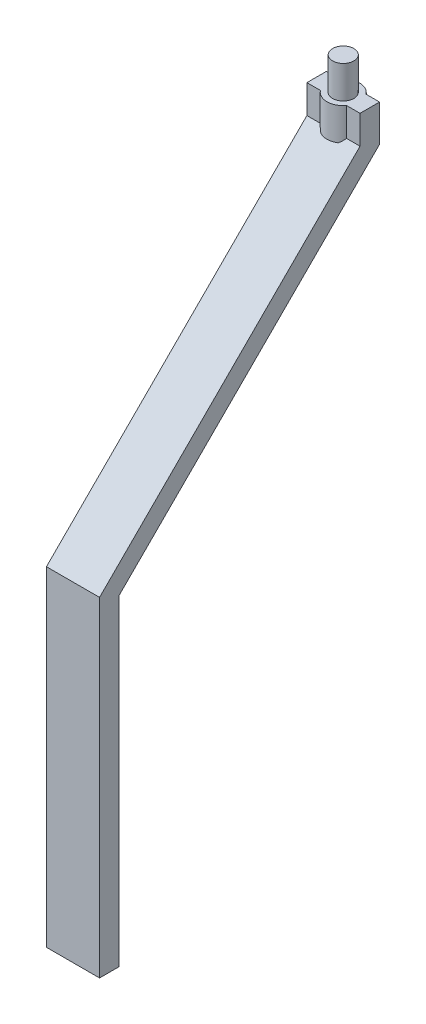
ISO-10303-21;
HEADER;
FILE_DESCRIPTION(('STEP AP214'),'2;1');
FILE_NAME('part.step','',(''),(''),'','','');
FILE_SCHEMA(('AUTOMOTIVE_DESIGN { 1 0 10303 214 1 1 1 1 }'));
ENDSEC;
DATA;
#1=APPLICATION_CONTEXT('core data for automotive mechanical design processes');
#2=APPLICATION_PROTOCOL_DEFINITION('international standard','automotive_design',2000,#1);
#3=PRODUCT_CONTEXT('',#1,'mechanical');
#4=PRODUCT('Part','Part','',(#3));
#5=PRODUCT_RELATED_PRODUCT_CATEGORY('part','',(#4));
#6=PRODUCT_DEFINITION_FORMATION('','',#4);
#7=PRODUCT_DEFINITION_CONTEXT('part definition',#1,'design');
#8=PRODUCT_DEFINITION('design','',#6,#7);
#9=PRODUCT_DEFINITION_SHAPE('','',#8);
#10=(LENGTH_UNIT() NAMED_UNIT(*) SI_UNIT(.MILLI.,.METRE.));
#11=(NAMED_UNIT(*) PLANE_ANGLE_UNIT() SI_UNIT($,.RADIAN.));
#12=(NAMED_UNIT(*) SI_UNIT($,.STERADIAN.) SOLID_ANGLE_UNIT());
#13=UNCERTAINTY_MEASURE_WITH_UNIT(LENGTH_MEASURE(1.E-05),#10,'distance_accuracy_value','');
#14=(GEOMETRIC_REPRESENTATION_CONTEXT(3) GLOBAL_UNCERTAINTY_ASSIGNED_CONTEXT((#13)) GLOBAL_UNIT_ASSIGNED_CONTEXT((#10,
#11,#12)) REPRESENTATION_CONTEXT('',''));
#15=CARTESIAN_POINT('',(0.,0.,0.));
#16=DIRECTION('',(0.,0.,1.));
#17=DIRECTION('',(1.,0.,0.));
#18=AXIS2_PLACEMENT_3D('',#15,#16,#17);
#19=CARTESIAN_POINT('',(20.395,-25.,7.5));
#20=DIRECTION('',(-1.,0.,0.));
#21=DIRECTION('',(0.,0.,1.));
#22=AXIS2_PLACEMENT_3D('',#19,#20,#21);
#23=PLANE('',#22);
#24=DIRECTION('',(0.,1.,0.));
#25=VECTOR('',#24,1.);
#26=CARTESIAN_POINT('',(20.395,-1730.,207.5));
#27=LINE('',#26,#25);
#28=CARTESIAN_POINT('',(20.395,-475.,207.5));
#29=VERTEX_POINT('',#28);
#30=CARTESIAN_POINT('',(20.395,-221.895801230595,207.5));
#31=VERTEX_POINT('',#30);
#32=EDGE_CURVE('E167',#29,#31,#27,.T.);
#33=ORIENTED_EDGE('',*,*,#32,.F.);
#34=DIRECTION('',(0.,0.,-1.));
#35=VECTOR('',#34,1.);
#36=CARTESIAN_POINT('',(20.395,-475.,7.5));
#37=LINE('',#36,#35);
#38=CARTESIAN_POINT('',(20.395,-475.,192.5));
#39=VERTEX_POINT('',#38);
#40=EDGE_CURVE('E74',#29,#39,#37,.T.);
#41=ORIENTED_EDGE('',*,*,#40,.T.);
#42=DIRECTION('',(0.,1.,0.));
#43=VECTOR('',#42,1.);
#44=CARTESIAN_POINT('',(20.395,-1730.,192.5));
#45=LINE('',#44,#43);
#46=CARTESIAN_POINT('',(20.395,-228.104198769413,192.5));
#47=VERTEX_POINT('',#46);
#48=EDGE_CURVE('E171',#39,#47,#45,.T.);
#49=ORIENTED_EDGE('',*,*,#48,.T.);
#50=DIRECTION('',(0.,-0.707106781186555,0.70710678118654));
#51=VECTOR('',#50,1.);
#52=CARTESIAN_POINT('',(20.395,-17.8020993847041,-17.8020993847045));
#53=LINE('',#52,#51);
#54=CARTESIAN_POINT('',(20.395,-28.1041987694089,-7.5));
#55=VERTEX_POINT('',#54);
#56=EDGE_CURVE('E265',#55,#47,#53,.T.);
#57=ORIENTED_EDGE('',*,*,#56,.F.);
#58=DIRECTION('',(0.,1.,0.));
#59=VECTOR('',#58,1.);
#60=CARTESIAN_POINT('',(20.395,-25.,-7.5));
#61=LINE('',#60,#59);
#62=CARTESIAN_POINT('',(20.395,0.,-7.5));
#63=VERTEX_POINT('',#62);
#64=EDGE_CURVE('E210',#55,#63,#61,.T.);
#65=ORIENTED_EDGE('',*,*,#64,.T.);
#66=DIRECTION('',(0.,0.,1.));
#67=VECTOR('',#66,1.);
#68=CARTESIAN_POINT('',(20.395,0.,7.5));
#69=LINE('',#68,#67);
#70=CARTESIAN_POINT('',(20.395,0.,7.5));
#71=VERTEX_POINT('',#70);
#72=EDGE_CURVE('E197',#63,#71,#69,.T.);
#73=ORIENTED_EDGE('',*,*,#72,.T.);
#74=DIRECTION('',(0.,1.,0.));
#75=VECTOR('',#74,1.);
#76=CARTESIAN_POINT('',(20.395,-25.,7.5));
#77=LINE('',#76,#75);
#78=CARTESIAN_POINT('',(20.395,-21.8958012305911,7.5));
#79=VERTEX_POINT('',#78);
#80=EDGE_CURVE('E218',#79,#71,#77,.T.);
#81=ORIENTED_EDGE('',*,*,#80,.F.);
#82=DIRECTION('',(0.,-0.707106781186554,0.707106781186541));
#83=VECTOR('',#82,1.);
#84=CARTESIAN_POINT('',(20.395,-7.19790061529532,-7.19790061529545));
#85=LINE('',#84,#83);
#86=EDGE_CURVE('E276',#79,#31,#85,.T.);
#87=ORIENTED_EDGE('',*,*,#86,.T.);
#88=EDGE_LOOP('',(#33,#41,#49,#57,#65,#73,#81,#87));
#89=FACE_BOUND('',#88,.T.);
#90=ADVANCED_FACE('F59',(#89),#23,.F.);
#91=CARTESIAN_POINT('',(-20.395,-25.,7.5));
#92=DIRECTION('',(1.,0.,0.));
#93=DIRECTION('',(0.,0.,-1.));
#94=AXIS2_PLACEMENT_3D('',#91,#92,#93);
#95=PLANE('',#94);
#96=DIRECTION('',(0.,1.,0.));
#97=VECTOR('',#96,1.);
#98=CARTESIAN_POINT('',(-20.395,-1730.,192.5));
#99=LINE('',#98,#97);
#100=CARTESIAN_POINT('',(-20.395,-475.,192.5));
#101=VERTEX_POINT('',#100);
#102=CARTESIAN_POINT('',(-20.395,-228.104198769413,192.5));
#103=VERTEX_POINT('',#102);
#104=EDGE_CURVE('E81',#101,#103,#99,.T.);
#105=ORIENTED_EDGE('',*,*,#104,.F.);
#106=DIRECTION('',(0.,0.,1.));
#107=VECTOR('',#106,1.);
#108=CARTESIAN_POINT('',(-20.395,-475.,7.5));
#109=LINE('',#108,#107);
#110=CARTESIAN_POINT('',(-20.3950000000001,-475.,207.5));
#111=VERTEX_POINT('',#110);
#112=EDGE_CURVE('E154',#101,#111,#109,.T.);
#113=ORIENTED_EDGE('',*,*,#112,.T.);
#114=DIRECTION('',(0.,1.,0.));
#115=VECTOR('',#114,1.);
#116=CARTESIAN_POINT('',(-20.395,-1730.,207.5));
#117=LINE('',#116,#115);
#118=CARTESIAN_POINT('',(-20.3950000000001,-221.895801230595,207.5));
#119=VERTEX_POINT('',#118);
#120=EDGE_CURVE('E160',#111,#119,#117,.T.);
#121=ORIENTED_EDGE('',*,*,#120,.T.);
#122=DIRECTION('',(0.,0.707106781186554,-0.707106781186541));
#123=VECTOR('',#122,1.);
#124=CARTESIAN_POINT('',(-20.395,-7.19790061529536,-7.19790061529542));
#125=LINE('',#124,#123);
#126=CARTESIAN_POINT('',(-20.395,-21.8958012305911,7.5));
#127=VERTEX_POINT('',#126);
#128=EDGE_CURVE('E241',#119,#127,#125,.T.);
#129=ORIENTED_EDGE('',*,*,#128,.T.);
#130=DIRECTION('',(0.,1.,0.));
#131=VECTOR('',#130,1.);
#132=CARTESIAN_POINT('',(-20.395,-25.,7.5));
#133=LINE('',#132,#131);
#134=CARTESIAN_POINT('',(-20.395,0.,7.5));
#135=VERTEX_POINT('',#134);
#136=EDGE_CURVE('E216',#127,#135,#133,.T.);
#137=ORIENTED_EDGE('',*,*,#136,.T.);
#138=DIRECTION('',(0.,0.,-1.));
#139=VECTOR('',#138,1.);
#140=CARTESIAN_POINT('',(-20.395,0.,7.5));
#141=LINE('',#140,#139);
#142=CARTESIAN_POINT('',(-20.395,0.,-7.5));
#143=VERTEX_POINT('',#142);
#144=EDGE_CURVE('E204',#135,#143,#141,.T.);
#145=ORIENTED_EDGE('',*,*,#144,.T.);
#146=DIRECTION('',(0.,1.,0.));
#147=VECTOR('',#146,1.);
#148=CARTESIAN_POINT('',(-20.395,-25.,-7.5));
#149=LINE('',#148,#147);
#150=CARTESIAN_POINT('',(-20.395,-28.1041987694089,-7.5));
#151=VERTEX_POINT('',#150);
#152=EDGE_CURVE('E213',#151,#143,#149,.T.);
#153=ORIENTED_EDGE('',*,*,#152,.F.);
#154=DIRECTION('',(0.,0.707106781186555,-0.70710678118654));
#155=VECTOR('',#154,1.);
#156=CARTESIAN_POINT('',(-20.395,-17.8020993847042,-17.8020993847045));
#157=LINE('',#156,#155);
#158=EDGE_CURVE('E267',#103,#151,#157,.T.);
#159=ORIENTED_EDGE('',*,*,#158,.F.);
#160=EDGE_LOOP('',(#105,#113,#121,#129,#137,#145,#153,#159));
#161=FACE_BOUND('',#160,.T.);
#162=ADVANCED_FACE('F159',(#161),#95,.F.);
#163=CARTESIAN_POINT('',(20.395,-1730.,192.5));
#164=DIRECTION('',(0.,0.,1.));
#165=DIRECTION('',(1.,0.,0.));
#166=AXIS2_PLACEMENT_3D('',#163,#164,#165);
#167=PLANE('',#166);
#168=ORIENTED_EDGE('',*,*,#48,.F.);
#169=DIRECTION('',(-1.,0.,0.));
#170=VECTOR('',#169,1.);
#171=CARTESIAN_POINT('',(20.395,-475.,192.5));
#172=LINE('',#171,#170);
#173=EDGE_CURVE('E280',#39,#101,#172,.T.);
#174=ORIENTED_EDGE('',*,*,#173,.T.);
#175=ORIENTED_EDGE('',*,*,#104,.T.);
#176=DIRECTION('',(1.,0.,0.));
#177=VECTOR('',#176,1.);
#178=CARTESIAN_POINT('',(-305.441163906419,-228.104198769413,192.5));
#179=LINE('',#178,#177);
#180=EDGE_CURVE('E264',#103,#47,#179,.T.);
#181=ORIENTED_EDGE('',*,*,#180,.T.);
#182=EDGE_LOOP('',(#168,#174,#175,#181));
#183=FACE_BOUND('',#182,.T.);
#184=ADVANCED_FACE('F283',(#183),#167,.F.);
#185=CARTESIAN_POINT('',(0.,-25.,0.));
#186=DIRECTION('',(0.,1.,0.));
#187=DIRECTION('',(0.,0.,1.));
#188=AXIS2_PLACEMENT_3D('',#185,#186,#187);
#189=PLANE('',#188);
#190=CARTESIAN_POINT('',(0.,-25.,0.));
#191=DIRECTION('',(0.,-1.,0.));
#192=DIRECTION('',(0.,0.,-1.));
#193=AXIS2_PLACEMENT_3D('',#190,#191,#192);
#194=CIRCLE('',#193,12.5);
#195=CARTESIAN_POINT('',(6.61823000951663,-25.,10.6041987694089));
#196=VERTEX_POINT('',#195);
#197=CARTESIAN_POINT('',(-6.61823000951662,-25.,10.6041987694089));
#198=VERTEX_POINT('',#197);
#199=EDGE_CURVE('E182',#196,#198,#194,.T.);
#200=ORIENTED_EDGE('',*,*,#199,.T.);
#201=DIRECTION('',(1.,0.,0.));
#202=VECTOR('',#201,1.);
#203=CARTESIAN_POINT('',(0.,-25.,10.6041987694089));
#204=LINE('',#203,#202);
#205=EDGE_CURVE('E233',#198,#196,#204,.T.);
#206=ORIENTED_EDGE('',*,*,#205,.T.);
#207=EDGE_LOOP('',(#200,#206));
#208=FACE_BOUND('',#207,.T.);
#209=ADVANCED_FACE('F291',(#208),#189,.F.);
#210=CARTESIAN_POINT('',(20.395,-25.,7.5));
#211=DIRECTION('',(0.,0.,-1.));
#212=DIRECTION('',(-1.,0.,0.));
#213=AXIS2_PLACEMENT_3D('',#210,#211,#212);
#214=PLANE('',#213);
#215=DIRECTION('',(0.,-1.,0.));
#216=VECTOR('',#215,1.);
#217=CARTESIAN_POINT('',(10.,35.3553390593274,7.5));
#218=LINE('',#217,#216);
#219=CARTESIAN_POINT('',(10.,0.,7.5));
#220=VERTEX_POINT('',#219);
#221=CARTESIAN_POINT('',(10.,-21.8958012305911,7.5));
#222=VERTEX_POINT('',#221);
#223=EDGE_CURVE('E194',#220,#222,#218,.T.);
#224=ORIENTED_EDGE('',*,*,#223,.T.);
#225=DIRECTION('',(1.,0.,0.));
#226=VECTOR('',#225,1.);
#227=CARTESIAN_POINT('',(-305.441163906419,-21.8958012305911,7.5));
#228=LINE('',#227,#226);
#229=EDGE_CURVE('E242',#222,#79,#228,.T.);
#230=ORIENTED_EDGE('',*,*,#229,.T.);
#231=ORIENTED_EDGE('',*,*,#80,.T.);
#232=DIRECTION('',(-1.,0.,0.));
#233=VECTOR('',#232,1.);
#234=CARTESIAN_POINT('',(20.395,0.,7.5));
#235=LINE('',#234,#233);
#236=EDGE_CURVE('E201',#71,#220,#235,.T.);
#237=ORIENTED_EDGE('',*,*,#236,.T.);
#238=EDGE_LOOP('',(#224,#230,#231,#237));
#239=FACE_BOUND('',#238,.T.);
#240=ADVANCED_FACE('F288',(#239),#214,.F.);
#241=CARTESIAN_POINT('',(0.,25.,0.));
#242=DIRECTION('',(0.,-1.,0.));
#243=DIRECTION('',(0.,0.,-1.));
#244=AXIS2_PLACEMENT_3D('',#241,#242,#243);
#245=CYLINDRICAL_SURFACE('',#244,8.2);
#246=CARTESIAN_POINT('',(0.,25.,0.));
#247=DIRECTION('',(0.,1.,0.));
#248=DIRECTION('',(0.,0.,1.));
#249=AXIS2_PLACEMENT_3D('',#246,#247,#248);
#250=CIRCLE('',#249,8.2);
#251=CARTESIAN_POINT('',(0.,25.,8.2));
#252=VERTEX_POINT('',#251);
#253=EDGE_CURVE('E179',#252,#252,#250,.T.);
#254=ORIENTED_EDGE('',*,*,#253,.F.);
#255=EDGE_LOOP('',(#254));
#256=FACE_BOUND('',#255,.T.);
#257=CARTESIAN_POINT('',(0.,0.,0.));
#258=DIRECTION('',(0.,1.,0.));
#259=DIRECTION('',(0.,0.,1.));
#260=AXIS2_PLACEMENT_3D('',#257,#258,#259);
#261=CIRCLE('',#260,8.2);
#262=CARTESIAN_POINT('',(0.,0.,8.2));
#263=VERTEX_POINT('',#262);
#264=EDGE_CURVE('E220',#263,#263,#261,.T.);
#265=ORIENTED_EDGE('',*,*,#264,.T.);
#266=EDGE_LOOP('',(#265));
#267=FACE_BOUND('',#266,.T.);
#268=ADVANCED_FACE('F61',(#256,#267),#245,.T.);
#269=CARTESIAN_POINT('',(0.,25.,0.));
#270=DIRECTION('',(0.,1.,0.));
#271=DIRECTION('',(0.,0.,1.));
#272=AXIS2_PLACEMENT_3D('',#269,#270,#271);
#273=PLANE('',#272);
#274=ORIENTED_EDGE('',*,*,#253,.T.);
#275=EDGE_LOOP('',(#274));
#276=FACE_BOUND('',#275,.T.);
#277=ADVANCED_FACE('F314',(#276),#273,.T.);
#278=CARTESIAN_POINT('',(0.,0.,0.));
#279=DIRECTION('',(0.,1.,0.));
#280=DIRECTION('',(0.,0.,1.));
#281=AXIS2_PLACEMENT_3D('',#278,#279,#280);
#282=PLANE('',#281);
#283=DIRECTION('',(1.,0.,0.));
#284=VECTOR('',#283,1.);
#285=CARTESIAN_POINT('',(20.395,0.,-7.5));
#286=LINE('',#285,#284);
#287=CARTESIAN_POINT('',(10.,0.,-7.5));
#288=VERTEX_POINT('',#287);
#289=EDGE_CURVE('E206',#288,#63,#286,.T.);
#290=ORIENTED_EDGE('',*,*,#289,.F.);
#291=CARTESIAN_POINT('',(0.,0.,0.));
#292=DIRECTION('',(0.,1.,0.));
#293=DIRECTION('',(0.,0.,1.));
#294=AXIS2_PLACEMENT_3D('',#291,#292,#293);
#295=CIRCLE('',#294,12.5);
#296=CARTESIAN_POINT('',(-10.,0.,-7.5));
#297=VERTEX_POINT('',#296);
#298=EDGE_CURVE('E186',#297,#288,#295,.F.);
#299=ORIENTED_EDGE('',*,*,#298,.F.);
#300=EDGE_CURVE('E207',#143,#297,#286,.T.);
#301=ORIENTED_EDGE('',*,*,#300,.F.);
#302=ORIENTED_EDGE('',*,*,#144,.F.);
#303=CARTESIAN_POINT('',(-10.,0.,7.5));
#304=VERTEX_POINT('',#303);
#305=EDGE_CURVE('E200',#304,#135,#235,.T.);
#306=ORIENTED_EDGE('',*,*,#305,.F.);
#307=EDGE_CURVE('E183',#220,#304,#295,.F.);
#308=ORIENTED_EDGE('',*,*,#307,.F.);
#309=ORIENTED_EDGE('',*,*,#236,.F.);
#310=ORIENTED_EDGE('',*,*,#72,.F.);
#311=EDGE_LOOP('',(#290,#299,#301,#302,#306,#308,#309,#310));
#312=FACE_BOUND('',#311,.T.);
#313=ORIENTED_EDGE('',*,*,#264,.F.);
#314=EDGE_LOOP('',(#313));
#315=FACE_BOUND('',#314,.T.);
#316=ADVANCED_FACE('F251',(#312,#315),#282,.T.);
#317=ORIENTED_EDGE('',*,*,#136,.F.);
#318=CARTESIAN_POINT('',(-10.,-21.8958012305911,7.5));
#319=VERTEX_POINT('',#318);
#320=EDGE_CURVE('E231',#127,#319,#228,.T.);
#321=ORIENTED_EDGE('',*,*,#320,.T.);
#322=DIRECTION('',(0.,-1.,0.));
#323=VECTOR('',#322,1.);
#324=CARTESIAN_POINT('',(-10.,35.3553390593274,7.5));
#325=LINE('',#324,#323);
#326=EDGE_CURVE('E192',#319,#304,#325,.F.);
#327=ORIENTED_EDGE('',*,*,#326,.T.);
#328=ORIENTED_EDGE('',*,*,#305,.T.);
#329=EDGE_LOOP('',(#317,#321,#327,#328));
#330=FACE_BOUND('',#329,.T.);
#331=ADVANCED_FACE('F239',(#330),#214,.F.);
#332=CARTESIAN_POINT('',(20.395,-25.,-7.5));
#333=DIRECTION('',(0.,0.,1.));
#334=DIRECTION('',(1.,0.,0.));
#335=AXIS2_PLACEMENT_3D('',#332,#333,#334);
#336=PLANE('',#335);
#337=ORIENTED_EDGE('',*,*,#64,.F.);
#338=DIRECTION('',(1.,0.,0.));
#339=VECTOR('',#338,1.);
#340=CARTESIAN_POINT('',(-305.441163906419,-28.1041987694089,-7.5));
#341=LINE('',#340,#339);
#342=EDGE_CURVE('E260',#151,#55,#341,.T.);
#343=ORIENTED_EDGE('',*,*,#342,.F.);
#344=ORIENTED_EDGE('',*,*,#152,.T.);
#345=ORIENTED_EDGE('',*,*,#300,.T.);
#346=DIRECTION('',(0.,-1.,0.));
#347=VECTOR('',#346,1.);
#348=CARTESIAN_POINT('',(-10.,35.3553390593274,-7.5));
#349=LINE('',#348,#347);
#350=CARTESIAN_POINT('',(-10.,-25.,-7.5));
#351=VERTEX_POINT('',#350);
#352=EDGE_CURVE('E190',#297,#351,#349,.T.);
#353=ORIENTED_EDGE('',*,*,#352,.T.);
#354=DIRECTION('',(-1.,0.,0.));
#355=VECTOR('',#354,1.);
#356=CARTESIAN_POINT('',(314.035937200521,-25.,-7.49999999999992));
#357=LINE('',#356,#355);
#358=CARTESIAN_POINT('',(10.,-25.,-7.5));
#359=VERTEX_POINT('',#358);
#360=EDGE_CURVE('E175',#359,#351,#357,.T.);
#361=ORIENTED_EDGE('',*,*,#360,.F.);
#362=DIRECTION('',(0.,-1.,0.));
#363=VECTOR('',#362,1.);
#364=CARTESIAN_POINT('',(10.,35.3553390593274,-7.5));
#365=LINE('',#364,#363);
#366=EDGE_CURVE('E187',#359,#288,#365,.F.);
#367=ORIENTED_EDGE('',*,*,#366,.T.);
#368=ORIENTED_EDGE('',*,*,#289,.T.);
#369=EDGE_LOOP('',(#337,#343,#344,#345,#353,#361,#367,#368));
#370=FACE_BOUND('',#369,.T.);
#371=ADVANCED_FACE('F258',(#370),#336,.F.);
#372=EDGE_CURVE('E169',#351,#359,#194,.T.);
#373=ORIENTED_EDGE('',*,*,#372,.T.);
#374=ORIENTED_EDGE('',*,*,#360,.T.);
#375=EDGE_LOOP('',(#373,#374));
#376=FACE_BOUND('',#375,.T.);
#377=ADVANCED_FACE('F294',(#376),#189,.F.);
#378=CARTESIAN_POINT('',(0.,35.3553390593274,0.));
#379=DIRECTION('',(0.,-1.,0.));
#380=DIRECTION('',(0.,0.,-1.));
#381=AXIS2_PLACEMENT_3D('',#378,#379,#380);
#382=CYLINDRICAL_SURFACE('',#381,12.5);
#383=ORIENTED_EDGE('',*,*,#352,.F.);
#384=ORIENTED_EDGE('',*,*,#298,.T.);
#385=ORIENTED_EDGE('',*,*,#366,.F.);
#386=ORIENTED_EDGE('',*,*,#372,.F.);
#387=EDGE_LOOP('',(#383,#384,#385,#386));
#388=FACE_BOUND('',#387,.T.);
#389=ADVANCED_FACE('F305',(#388),#382,.T.);
#390=CARTESIAN_POINT('',(0.,-14.3958012305909,0.));
#391=DIRECTION('',(0.,0.707106781186541,0.707106781186554));
#392=DIRECTION('',(0.,-0.707106781186554,0.707106781186541));
#393=AXIS2_PLACEMENT_3D('',#390,#391,#392);
#394=ELLIPSE('',#393,17.6776695296638,12.5);
#395=EDGE_CURVE('E67',#198,#319,#394,.F.);
#396=ORIENTED_EDGE('',*,*,#395,.F.);
#397=ORIENTED_EDGE('',*,*,#199,.F.);
#398=EDGE_CURVE('E178',#222,#196,#394,.F.);
#399=ORIENTED_EDGE('',*,*,#398,.F.);
#400=ORIENTED_EDGE('',*,*,#223,.F.);
#401=ORIENTED_EDGE('',*,*,#307,.T.);
#402=ORIENTED_EDGE('',*,*,#326,.F.);
#403=EDGE_LOOP('',(#396,#397,#399,#400,#401,#402));
#404=FACE_BOUND('',#403,.T.);
#405=ADVANCED_FACE('F244',(#404),#382,.T.);
#406=CARTESIAN_POINT('',(20.395,-1730.,207.5));
#407=DIRECTION('',(0.,0.,-1.));
#408=DIRECTION('',(-1.,0.,0.));
#409=AXIS2_PLACEMENT_3D('',#406,#407,#408);
#410=PLANE('',#409);
#411=ORIENTED_EDGE('',*,*,#120,.F.);
#412=DIRECTION('',(1.,0.,0.));
#413=VECTOR('',#412,1.);
#414=CARTESIAN_POINT('',(20.395,-475.,207.5));
#415=LINE('',#414,#413);
#416=EDGE_CURVE('E12',#111,#29,#415,.T.);
#417=ORIENTED_EDGE('',*,*,#416,.T.);
#418=ORIENTED_EDGE('',*,*,#32,.T.);
#419=DIRECTION('',(1.,0.,0.));
#420=VECTOR('',#419,1.);
#421=CARTESIAN_POINT('',(-305.441163906419,-221.895801230595,207.5));
#422=LINE('',#421,#420);
#423=EDGE_CURVE('E166',#119,#31,#422,.T.);
#424=ORIENTED_EDGE('',*,*,#423,.F.);
#425=EDGE_LOOP('',(#411,#417,#418,#424));
#426=FACE_BOUND('',#425,.T.);
#427=ADVANCED_FACE('F164',(#426),#410,.F.);
#428=CARTESIAN_POINT('',(-305.441163906419,-17.8020993847041,-17.8020993847045));
#429=DIRECTION('',(0.,0.70710678118654,0.707106781186555));
#430=DIRECTION('',(0.,-0.707106781186555,0.70710678118654));
#431=AXIS2_PLACEMENT_3D('',#428,#429,#430);
#432=PLANE('',#431);
#433=ORIENTED_EDGE('',*,*,#180,.F.);
#434=ORIENTED_EDGE('',*,*,#158,.T.);
#435=ORIENTED_EDGE('',*,*,#342,.T.);
#436=ORIENTED_EDGE('',*,*,#56,.T.);
#437=EDGE_LOOP('',(#433,#434,#435,#436));
#438=FACE_BOUND('',#437,.T.);
#439=ADVANCED_FACE('F284',(#438),#432,.F.);
#440=CARTESIAN_POINT('',(-305.441163906419,-7.19790061529532,-7.19790061529545));
#441=DIRECTION('',(0.,0.707106781186541,0.707106781186554));
#442=DIRECTION('',(0.,-0.707106781186554,0.707106781186541));
#443=AXIS2_PLACEMENT_3D('',#440,#441,#442);
#444=PLANE('',#443);
#445=ORIENTED_EDGE('',*,*,#205,.F.);
#446=ORIENTED_EDGE('',*,*,#395,.T.);
#447=ORIENTED_EDGE('',*,*,#320,.F.);
#448=ORIENTED_EDGE('',*,*,#128,.F.);
#449=ORIENTED_EDGE('',*,*,#423,.T.);
#450=ORIENTED_EDGE('',*,*,#86,.F.);
#451=ORIENTED_EDGE('',*,*,#229,.F.);
#452=ORIENTED_EDGE('',*,*,#398,.T.);
#453=EDGE_LOOP('',(#445,#446,#447,#448,#449,#450,#451,#452));
#454=FACE_BOUND('',#453,.T.);
#455=ADVANCED_FACE('F230',(#454),#444,.T.);
#456=CARTESIAN_POINT('',(0.,-475.,0.));
#457=DIRECTION('',(0.,1.,0.));
#458=DIRECTION('',(0.,0.,1.));
#459=AXIS2_PLACEMENT_3D('',#456,#457,#458);
#460=PLANE('',#459);
#461=ORIENTED_EDGE('',*,*,#40,.F.);
#462=ORIENTED_EDGE('',*,*,#416,.F.);
#463=ORIENTED_EDGE('',*,*,#112,.F.);
#464=ORIENTED_EDGE('',*,*,#173,.F.);
#465=EDGE_LOOP('',(#461,#462,#463,#464));
#466=FACE_BOUND('',#465,.T.);
#467=ADVANCED_FACE('F153',(#466),#460,.F.);
#468=CLOSED_SHELL('',(#90,#162,#184,#209,#240,#268,#277,#316,#331,#371,#377,#389,#405,#427,#439,
#455,#467));
#469=MANIFOLD_SOLID_BREP('B2',#468);
#470=ADVANCED_BREP_SHAPE_REPRESENTATION('',(#18,#469),#14);
#471=SHAPE_DEFINITION_REPRESENTATION(#9,#470);
ENDSEC;
END-ISO-10303-21;
